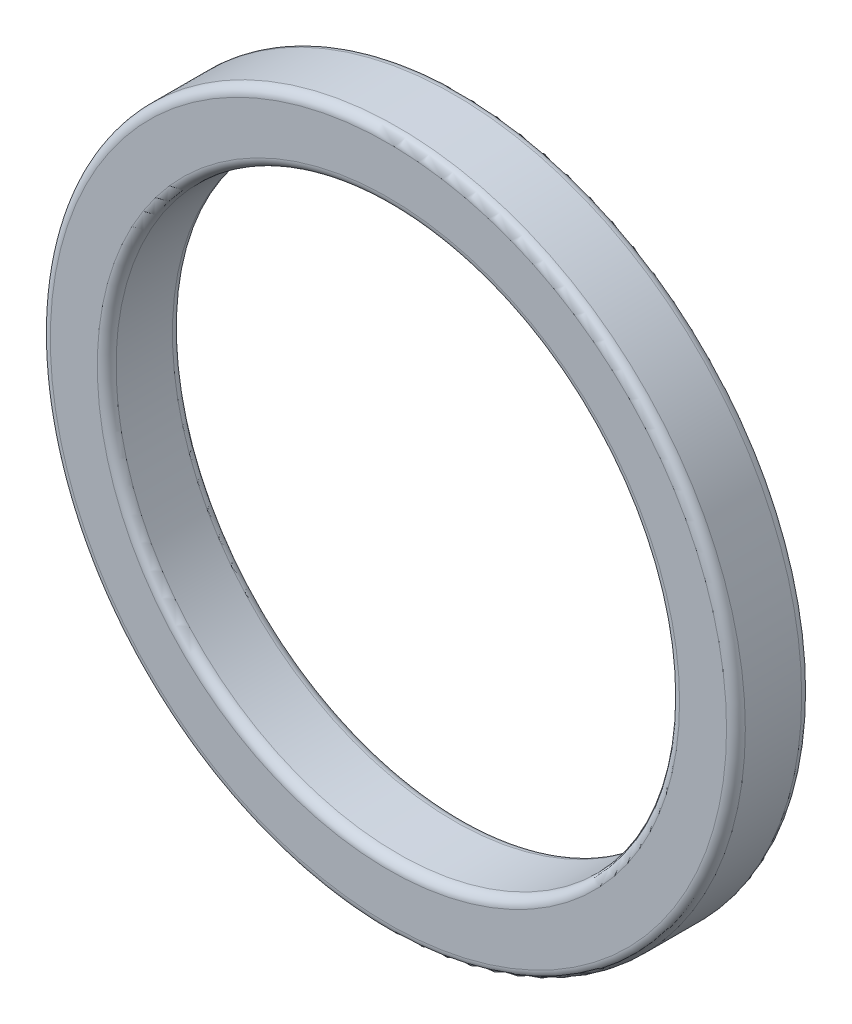
ISO-10303-21;
HEADER;
FILE_DESCRIPTION(('STEP AP214'),'2;1');
FILE_NAME('part.step','',(''),(''),'','','');
FILE_SCHEMA(('AUTOMOTIVE_DESIGN { 1 0 10303 214 1 1 1 1 }'));
ENDSEC;
DATA;
#1=APPLICATION_CONTEXT('core data for automotive mechanical design processes');
#2=APPLICATION_PROTOCOL_DEFINITION('international standard','automotive_design',2000,#1);
#3=PRODUCT_CONTEXT('',#1,'mechanical');
#4=PRODUCT('Part','Part','',(#3));
#5=PRODUCT_RELATED_PRODUCT_CATEGORY('part','',(#4));
#6=PRODUCT_DEFINITION_FORMATION('','',#4);
#7=PRODUCT_DEFINITION_CONTEXT('part definition',#1,'design');
#8=PRODUCT_DEFINITION('design','',#6,#7);
#9=PRODUCT_DEFINITION_SHAPE('','',#8);
#10=(LENGTH_UNIT() NAMED_UNIT(*) SI_UNIT(.MILLI.,.METRE.));
#11=(NAMED_UNIT(*) PLANE_ANGLE_UNIT() SI_UNIT($,.RADIAN.));
#12=(NAMED_UNIT(*) SI_UNIT($,.STERADIAN.) SOLID_ANGLE_UNIT());
#13=UNCERTAINTY_MEASURE_WITH_UNIT(LENGTH_MEASURE(1.E-05),#10,'distance_accuracy_value','');
#14=(GEOMETRIC_REPRESENTATION_CONTEXT(3) GLOBAL_UNCERTAINTY_ASSIGNED_CONTEXT((#13)) GLOBAL_UNIT_ASSIGNED_CONTEXT((#10,
#11,#12)) REPRESENTATION_CONTEXT('',''));
#15=CARTESIAN_POINT('',(0.,0.,0.));
#16=DIRECTION('',(0.,0.,1.));
#17=DIRECTION('',(1.,0.,0.));
#18=AXIS2_PLACEMENT_3D('',#15,#16,#17);
#19=CARTESIAN_POINT('',(0.,0.,4.));
#20=DIRECTION('',(0.,0.,1.));
#21=DIRECTION('',(1.,0.,0.));
#22=AXIS2_PLACEMENT_3D('',#19,#20,#21);
#23=PLANE('',#22);
#24=CARTESIAN_POINT('',(0.,0.,4.));
#25=DIRECTION('',(0.,0.,1.));
#26=DIRECTION('',(1.,0.,0.));
#27=AXIS2_PLACEMENT_3D('',#24,#25,#26);
#28=CIRCLE('',#27,15.5);
#29=CARTESIAN_POINT('',(15.5,0.,4.));
#30=VERTEX_POINT('',#29);
#31=EDGE_CURVE('E10',#30,#30,#28,.F.);
#32=ORIENTED_EDGE('',*,*,#31,.T.);
#33=EDGE_LOOP('',(#32));
#34=FACE_BOUND('',#33,.T.);
#35=CARTESIAN_POINT('',(0.,0.,4.));
#36=DIRECTION('',(0.,0.,1.));
#37=DIRECTION('',(1.,0.,0.));
#38=AXIS2_PLACEMENT_3D('',#35,#36,#37);
#39=CIRCLE('',#38,18.);
#40=CARTESIAN_POINT('',(18.,0.,4.));
#41=VERTEX_POINT('',#40);
#42=EDGE_CURVE('E44',#41,#41,#39,.T.);
#43=ORIENTED_EDGE('',*,*,#42,.T.);
#44=EDGE_LOOP('',(#43));
#45=FACE_BOUND('',#44,.T.);
#46=ADVANCED_FACE('F37',(#34,#45),#23,.T.);
#47=CARTESIAN_POINT('',(0.,0.,0.));
#48=DIRECTION('',(0.,0.,1.));
#49=DIRECTION('',(1.,0.,0.));
#50=AXIS2_PLACEMENT_3D('',#47,#48,#49);
#51=PLANE('',#50);
#52=CARTESIAN_POINT('',(0.,0.,0.));
#53=DIRECTION('',(0.,0.,1.));
#54=DIRECTION('',(1.,0.,0.));
#55=AXIS2_PLACEMENT_3D('',#52,#53,#54);
#56=CIRCLE('',#55,15.5);
#57=CARTESIAN_POINT('',(15.5,0.,0.));
#58=VERTEX_POINT('',#57);
#59=EDGE_CURVE('E63',#58,#58,#56,.T.);
#60=ORIENTED_EDGE('',*,*,#59,.T.);
#61=EDGE_LOOP('',(#60));
#62=FACE_BOUND('',#61,.T.);
#63=CARTESIAN_POINT('',(0.,0.,0.));
#64=DIRECTION('',(0.,0.,1.));
#65=DIRECTION('',(1.,0.,0.));
#66=AXIS2_PLACEMENT_3D('',#63,#64,#65);
#67=CIRCLE('',#66,18.);
#68=CARTESIAN_POINT('',(18.,0.,0.));
#69=VERTEX_POINT('',#68);
#70=EDGE_CURVE('E66',#69,#69,#67,.F.);
#71=ORIENTED_EDGE('',*,*,#70,.T.);
#72=EDGE_LOOP('',(#71));
#73=FACE_BOUND('',#72,.T.);
#74=ADVANCED_FACE('F70',(#62,#73),#51,.F.);
#75=CARTESIAN_POINT('',(0.,0.,4.));
#76=DIRECTION('',(0.,0.,-1.));
#77=DIRECTION('',(-1.,0.,0.));
#78=AXIS2_PLACEMENT_3D('',#75,#76,#77);
#79=CYLINDRICAL_SURFACE('',#78,18.5);
#80=CARTESIAN_POINT('',(0.,0.,0.5));
#81=DIRECTION('',(0.,0.,1.));
#82=DIRECTION('',(1.,0.,0.));
#83=AXIS2_PLACEMENT_3D('',#80,#81,#82);
#84=CIRCLE('',#83,18.5);
#85=CARTESIAN_POINT('',(18.5,0.,0.5));
#86=VERTEX_POINT('',#85);
#87=EDGE_CURVE('E48',#86,#86,#84,.T.);
#88=ORIENTED_EDGE('',*,*,#87,.T.);
#89=EDGE_LOOP('',(#88));
#90=FACE_BOUND('',#89,.T.);
#91=CARTESIAN_POINT('',(0.,0.,3.5));
#92=DIRECTION('',(0.,0.,1.));
#93=DIRECTION('',(1.,0.,0.));
#94=AXIS2_PLACEMENT_3D('',#91,#92,#93);
#95=CIRCLE('',#94,18.5);
#96=CARTESIAN_POINT('',(18.5,0.,3.5));
#97=VERTEX_POINT('',#96);
#98=EDGE_CURVE('E52',#97,#97,#95,.F.);
#99=ORIENTED_EDGE('',*,*,#98,.T.);
#100=EDGE_LOOP('',(#99));
#101=FACE_BOUND('',#100,.T.);
#102=ADVANCED_FACE('F80',(#90,#101),#79,.T.);
#103=CARTESIAN_POINT('',(0.,0.,4.));
#104=DIRECTION('',(0.,0.,-1.));
#105=DIRECTION('',(-1.,0.,0.));
#106=AXIS2_PLACEMENT_3D('',#103,#104,#105);
#107=CYLINDRICAL_SURFACE('',#106,15.);
#108=CARTESIAN_POINT('',(0.,0.,0.5));
#109=DIRECTION('',(0.,0.,1.));
#110=DIRECTION('',(1.,0.,0.));
#111=AXIS2_PLACEMENT_3D('',#108,#109,#110);
#112=CIRCLE('',#111,15.);
#113=CARTESIAN_POINT('',(15.,0.,0.5));
#114=VERTEX_POINT('',#113);
#115=EDGE_CURVE('E57',#114,#114,#112,.F.);
#116=ORIENTED_EDGE('',*,*,#115,.T.);
#117=EDGE_LOOP('',(#116));
#118=FACE_BOUND('',#117,.T.);
#119=CARTESIAN_POINT('',(0.,0.,3.5));
#120=DIRECTION('',(0.,0.,1.));
#121=DIRECTION('',(1.,0.,0.));
#122=AXIS2_PLACEMENT_3D('',#119,#120,#121);
#123=CIRCLE('',#122,15.);
#124=CARTESIAN_POINT('',(15.,0.,3.5));
#125=VERTEX_POINT('',#124);
#126=EDGE_CURVE('E60',#125,#125,#123,.T.);
#127=ORIENTED_EDGE('',*,*,#126,.T.);
#128=EDGE_LOOP('',(#127));
#129=FACE_BOUND('',#128,.T.);
#130=ADVANCED_FACE('F83',(#118,#129),#107,.F.);
#131=CARTESIAN_POINT('',(0.,0.,0.5));
#132=DIRECTION('',(0.,0.,1.));
#133=DIRECTION('',(1.,0.,0.));
#134=AXIS2_PLACEMENT_3D('',#131,#132,#133);
#135=TOROIDAL_SURFACE('',#134,15.5,0.5);
#136=ORIENTED_EDGE('',*,*,#115,.F.);
#137=EDGE_LOOP('',(#136));
#138=FACE_BOUND('',#137,.T.);
#139=ORIENTED_EDGE('',*,*,#59,.F.);
#140=EDGE_LOOP('',(#139));
#141=FACE_BOUND('',#140,.T.);
#142=ADVANCED_FACE('F76',(#138,#141),#135,.T.);
#143=CARTESIAN_POINT('',(0.,0.,0.5));
#144=DIRECTION('',(0.,0.,1.));
#145=DIRECTION('',(1.,0.,0.));
#146=AXIS2_PLACEMENT_3D('',#143,#144,#145);
#147=TOROIDAL_SURFACE('',#146,18.,0.5);
#148=ORIENTED_EDGE('',*,*,#70,.F.);
#149=EDGE_LOOP('',(#148));
#150=FACE_BOUND('',#149,.T.);
#151=ORIENTED_EDGE('',*,*,#87,.F.);
#152=EDGE_LOOP('',(#151));
#153=FACE_BOUND('',#152,.T.);
#154=ADVANCED_FACE('F72',(#150,#153),#147,.T.);
#155=CARTESIAN_POINT('',(0.,0.,3.5));
#156=DIRECTION('',(0.,0.,1.));
#157=DIRECTION('',(1.,0.,0.));
#158=AXIS2_PLACEMENT_3D('',#155,#156,#157);
#159=TOROIDAL_SURFACE('',#158,15.5,0.5);
#160=ORIENTED_EDGE('',*,*,#31,.F.);
#161=EDGE_LOOP('',(#160));
#162=FACE_BOUND('',#161,.T.);
#163=ORIENTED_EDGE('',*,*,#126,.F.);
#164=EDGE_LOOP('',(#163));
#165=FACE_BOUND('',#164,.T.);
#166=ADVANCED_FACE('F75',(#162,#165),#159,.T.);
#167=CARTESIAN_POINT('',(0.,0.,3.5));
#168=DIRECTION('',(0.,0.,1.));
#169=DIRECTION('',(1.,0.,0.));
#170=AXIS2_PLACEMENT_3D('',#167,#168,#169);
#171=TOROIDAL_SURFACE('',#170,18.,0.5);
#172=ORIENTED_EDGE('',*,*,#98,.F.);
#173=EDGE_LOOP('',(#172));
#174=FACE_BOUND('',#173,.T.);
#175=ORIENTED_EDGE('',*,*,#42,.F.);
#176=EDGE_LOOP('',(#175));
#177=FACE_BOUND('',#176,.T.);
#178=ADVANCED_FACE('F39',(#174,#177),#171,.T.);
#179=CLOSED_SHELL('',(#46,#74,#102,#130,#142,#154,#166,#178));
#180=MANIFOLD_SOLID_BREP('B2',#179);
#181=ADVANCED_BREP_SHAPE_REPRESENTATION('',(#18,#180),#14);
#182=SHAPE_DEFINITION_REPRESENTATION(#9,#181);
ENDSEC;
END-ISO-10303-21;
